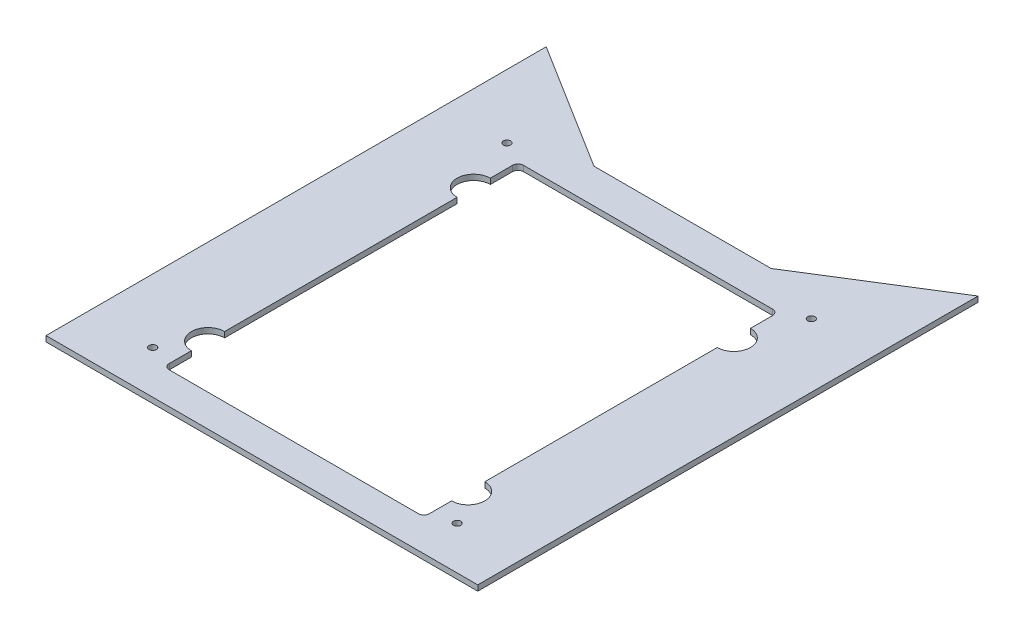
ISO-10303-21;
HEADER;
FILE_DESCRIPTION(('STEP AP214'),'2;1');
FILE_NAME('part.step','',(''),(''),'','','');
FILE_SCHEMA(('AUTOMOTIVE_DESIGN { 1 0 10303 214 1 1 1 1 }'));
ENDSEC;
DATA;
#1=APPLICATION_CONTEXT('core data for automotive mechanical design processes');
#2=APPLICATION_PROTOCOL_DEFINITION('international standard','automotive_design',2000,#1);
#3=PRODUCT_CONTEXT('',#1,'mechanical');
#4=PRODUCT('Part','Part','',(#3));
#5=PRODUCT_RELATED_PRODUCT_CATEGORY('part','',(#4));
#6=PRODUCT_DEFINITION_FORMATION('','',#4);
#7=PRODUCT_DEFINITION_CONTEXT('part definition',#1,'design');
#8=PRODUCT_DEFINITION('design','',#6,#7);
#9=PRODUCT_DEFINITION_SHAPE('','',#8);
#10=(LENGTH_UNIT() NAMED_UNIT(*) SI_UNIT(.MILLI.,.METRE.));
#11=(NAMED_UNIT(*) PLANE_ANGLE_UNIT() SI_UNIT($,.RADIAN.));
#12=(NAMED_UNIT(*) SI_UNIT($,.STERADIAN.) SOLID_ANGLE_UNIT());
#13=UNCERTAINTY_MEASURE_WITH_UNIT(LENGTH_MEASURE(1.E-05),#10,'distance_accuracy_value','');
#14=(GEOMETRIC_REPRESENTATION_CONTEXT(3) GLOBAL_UNCERTAINTY_ASSIGNED_CONTEXT((#13)) GLOBAL_UNIT_ASSIGNED_CONTEXT((#10,
#11,#12)) REPRESENTATION_CONTEXT('',''));
#15=CARTESIAN_POINT('',(0.,0.,0.));
#16=DIRECTION('',(0.,0.,1.));
#17=DIRECTION('',(1.,0.,0.));
#18=AXIS2_PLACEMENT_3D('',#15,#16,#17);
#19=CARTESIAN_POINT('',(0.,3.175,0.));
#20=DIRECTION('',(0.,1.,0.));
#21=DIRECTION('',(0.,0.,1.));
#22=AXIS2_PLACEMENT_3D('',#19,#20,#21);
#23=PLANE('',#22);
#24=DIRECTION('',(0.,0.,-1.));
#25=VECTOR('',#24,1.);
#26=CARTESIAN_POINT('',(-99.8118353735841,3.175,0.));
#27=LINE('',#26,#25);
#28=CARTESIAN_POINT('',(-99.8118353735841,3.175,438.1716513619));
#29=VERTEX_POINT('',#28);
#30=CARTESIAN_POINT('',(-99.8118353735841,3.175,151.2310263619));
#31=VERTEX_POINT('',#30);
#32=EDGE_CURVE('E57',#29,#31,#27,.T.);
#33=ORIENTED_EDGE('',*,*,#32,.F.);
#34=DIRECTION('',(1.,0.,0.));
#35=VECTOR('',#34,1.);
#36=CARTESIAN_POINT('',(-191.886835373584,3.175,438.1716513619));
#37=LINE('',#36,#35);
#38=CARTESIAN_POINT('',(147.838164626416,3.175,438.1716513619));
#39=VERTEX_POINT('',#38);
#40=EDGE_CURVE('E198',#29,#39,#37,.T.);
#41=ORIENTED_EDGE('',*,*,#40,.T.);
#42=DIRECTION('',(0.,0.,1.));
#43=VECTOR('',#42,1.);
#44=CARTESIAN_POINT('',(147.838164626416,3.175,0.));
#45=LINE('',#44,#43);
#46=CARTESIAN_POINT('',(147.838164626416,3.175,151.2310263619));
#47=VERTEX_POINT('',#46);
#48=EDGE_CURVE('E408',#47,#39,#45,.T.);
#49=ORIENTED_EDGE('',*,*,#48,.F.);
#50=DIRECTION('',(-0.847998304005083,0.,0.529998940003187));
#51=VECTOR('',#50,1.);
#52=CARTESIAN_POINT('',(176.413164626416,3.175,133.371651361899));
#53=LINE('',#52,#51);
#54=CARTESIAN_POINT('',(74.8131646264159,3.175,196.871651361901));
#55=VERTEX_POINT('',#54);
#56=EDGE_CURVE('E268',#47,#55,#53,.T.);
#57=ORIENTED_EDGE('',*,*,#56,.T.);
#58=DIRECTION('',(-1.,0.,0.));
#59=VECTOR('',#58,1.);
#60=CARTESIAN_POINT('',(74.8131646264159,3.175,196.871651361901));
#61=LINE('',#60,#59);
#62=CARTESIAN_POINT('',(-26.7868353735841,3.175,196.871651361901));
#63=VERTEX_POINT('',#62);
#64=EDGE_CURVE('E266',#55,#63,#61,.T.);
#65=ORIENTED_EDGE('',*,*,#64,.T.);
#66=DIRECTION('',(-0.847998304005083,0.,-0.529998940003187));
#67=VECTOR('',#66,1.);
#68=CARTESIAN_POINT('',(-128.386835373584,3.175,133.371651361899));
#69=LINE('',#68,#67);
#70=EDGE_CURVE('E211',#63,#31,#69,.T.);
#71=ORIENTED_EDGE('',*,*,#70,.T.);
#72=EDGE_LOOP('',(#33,#41,#49,#57,#65,#71));
#73=FACE_BOUND('',#72,.T.);
#74=CARTESIAN_POINT('',(111.32566462639,3.175,413.498576853187));
#75=DIRECTION('',(0.,1.,0.));
#76=DIRECTION('',(0.,0.,1.));
#77=AXIS2_PLACEMENT_3D('',#74,#75,#76);
#78=CIRCLE('',#77,2.08280000000002);
#79=CARTESIAN_POINT('',(111.32566462639,3.175,415.581376853187));
#80=VERTEX_POINT('',#79);
#81=EDGE_CURVE('E304',#80,#80,#78,.T.);
#82=ORIENTED_EDGE('',*,*,#81,.F.);
#83=EDGE_LOOP('',(#82));
#84=FACE_BOUND('',#83,.T.);
#85=CARTESIAN_POINT('',(-63.2993353736587,3.175,413.498576853187));
#86=DIRECTION('',(0.,1.,0.));
#87=DIRECTION('',(0.,0.,-1.));
#88=AXIS2_PLACEMENT_3D('',#85,#86,#87);
#89=CIRCLE('',#88,2.0828);
#90=CARTESIAN_POINT('',(-63.2993353736587,3.175,411.415776853187));
#91=VERTEX_POINT('',#90);
#92=EDGE_CURVE('E468',#91,#91,#89,.T.);
#93=ORIENTED_EDGE('',*,*,#92,.F.);
#94=EDGE_LOOP('',(#93));
#95=FACE_BOUND('',#94,.T.);
#96=CARTESIAN_POINT('',(-63.2993353736587,3.175,210.298576853187));
#97=DIRECTION('',(0.,1.,0.));
#98=DIRECTION('',(0.,0.,-1.));
#99=AXIS2_PLACEMENT_3D('',#96,#97,#98);
#100=CIRCLE('',#99,2.0828);
#101=CARTESIAN_POINT('',(-63.2993353736587,3.175,208.215776853187));
#102=VERTEX_POINT('',#101);
#103=EDGE_CURVE('E475',#102,#102,#100,.T.);
#104=ORIENTED_EDGE('',*,*,#103,.F.);
#105=EDGE_LOOP('',(#104));
#106=FACE_BOUND('',#105,.T.);
#107=CARTESIAN_POINT('',(98.6256646263904,3.175,394.448576853187));
#108=DIRECTION('',(0.,1.,0.));
#109=DIRECTION('',(0.,0.,1.));
#110=AXIS2_PLACEMENT_3D('',#107,#108,#109);
#111=CIRCLE('',#110,9.52500000000001);
#112=CARTESIAN_POINT('',(98.6256646263904,3.175,403.973576853187));
#113=VERTEX_POINT('',#112);
#114=CARTESIAN_POINT('',(98.6256646263904,3.175,384.923576853187));
#115=VERTEX_POINT('',#114);
#116=EDGE_CURVE('E364',#113,#115,#111,.T.);
#117=ORIENTED_EDGE('',*,*,#116,.F.);
#118=DIRECTION('',(0.,0.,-1.));
#119=VECTOR('',#118,1.);
#120=CARTESIAN_POINT('',(98.6256646263904,3.175,403.973576853187));
#121=LINE('',#120,#119);
#122=CARTESIAN_POINT('',(98.6256646263904,3.175,416.673576853187));
#123=VERTEX_POINT('',#122);
#124=EDGE_CURVE('E440',#123,#113,#121,.T.);
#125=ORIENTED_EDGE('',*,*,#124,.F.);
#126=CARTESIAN_POINT('',(95.4506646263903,3.175,416.673576853187));
#127=DIRECTION('',(0.,1.,0.));
#128=DIRECTION('',(0.,0.,1.));
#129=AXIS2_PLACEMENT_3D('',#126,#127,#128);
#130=CIRCLE('',#129,3.175);
#131=CARTESIAN_POINT('',(95.4506646263903,3.175,419.848576853187));
#132=VERTEX_POINT('',#131);
#133=EDGE_CURVE('E250',#123,#132,#130,.F.);
#134=ORIENTED_EDGE('',*,*,#133,.T.);
#135=DIRECTION('',(1.,0.,0.));
#136=VECTOR('',#135,1.);
#137=CARTESIAN_POINT('',(-50.5993353736097,3.175,419.848576853187));
#138=LINE('',#137,#136);
#139=CARTESIAN_POINT('',(-47.4243353736097,3.175,419.848576853187));
#140=VERTEX_POINT('',#139);
#141=EDGE_CURVE('E400',#140,#132,#138,.T.);
#142=ORIENTED_EDGE('',*,*,#141,.F.);
#143=CARTESIAN_POINT('',(-47.4243353736097,3.175,416.673576853187));
#144=DIRECTION('',(0.,1.,0.));
#145=DIRECTION('',(0.,0.,1.));
#146=AXIS2_PLACEMENT_3D('',#143,#144,#145);
#147=CIRCLE('',#146,3.175);
#148=CARTESIAN_POINT('',(-50.5993353736097,3.175,416.673576853187));
#149=VERTEX_POINT('',#148);
#150=EDGE_CURVE('E246',#140,#149,#147,.F.);
#151=ORIENTED_EDGE('',*,*,#150,.T.);
#152=DIRECTION('',(0.,0.,1.));
#153=VECTOR('',#152,1.);
#154=CARTESIAN_POINT('',(-50.5993353736097,3.175,403.973576853187));
#155=LINE('',#154,#153);
#156=CARTESIAN_POINT('',(-50.5993353736097,3.175,403.973576853187));
#157=VERTEX_POINT('',#156);
#158=EDGE_CURVE('E397',#157,#149,#155,.T.);
#159=ORIENTED_EDGE('',*,*,#158,.F.);
#160=CARTESIAN_POINT('',(-50.5993353736097,3.175,394.448576853187));
#161=DIRECTION('',(0.,1.,0.));
#162=DIRECTION('',(0.,0.,1.));
#163=AXIS2_PLACEMENT_3D('',#160,#161,#162);
#164=CIRCLE('',#163,9.52500000000001);
#165=CARTESIAN_POINT('',(-50.5993353736097,3.175,384.923576853187));
#166=VERTEX_POINT('',#165);
#167=EDGE_CURVE('E389',#166,#157,#164,.T.);
#168=ORIENTED_EDGE('',*,*,#167,.F.);
#169=DIRECTION('',(0.,0.,1.));
#170=VECTOR('',#169,1.);
#171=CARTESIAN_POINT('',(-50.5993353736097,3.175,251.573576853187));
#172=LINE('',#171,#170);
#173=CARTESIAN_POINT('',(-50.5993353736097,3.175,251.573576853187));
#174=VERTEX_POINT('',#173);
#175=EDGE_CURVE('E386',#174,#166,#172,.T.);
#176=ORIENTED_EDGE('',*,*,#175,.F.);
#177=CARTESIAN_POINT('',(-50.5993353736097,3.175,242.048576853187));
#178=DIRECTION('',(0.,1.,0.));
#179=DIRECTION('',(0.,0.,1.));
#180=AXIS2_PLACEMENT_3D('',#177,#178,#179);
#181=CIRCLE('',#180,9.52500000000001);
#182=CARTESIAN_POINT('',(-50.5993353736097,3.175,232.523576853187));
#183=VERTEX_POINT('',#182);
#184=EDGE_CURVE('E383',#183,#174,#181,.T.);
#185=ORIENTED_EDGE('',*,*,#184,.F.);
#186=DIRECTION('',(0.,0.,1.));
#187=VECTOR('',#186,1.);
#188=CARTESIAN_POINT('',(-50.5993353736097,3.175,216.648576853187));
#189=LINE('',#188,#187);
#190=CARTESIAN_POINT('',(-50.5993353736097,3.175,219.823576853187));
#191=VERTEX_POINT('',#190);
#192=EDGE_CURVE('E381',#191,#183,#189,.T.);
#193=ORIENTED_EDGE('',*,*,#192,.F.);
#194=CARTESIAN_POINT('',(-47.4243353736097,3.175,219.823576853187));
#195=DIRECTION('',(0.,1.,0.));
#196=DIRECTION('',(0.,0.,1.));
#197=AXIS2_PLACEMENT_3D('',#194,#195,#196);
#198=CIRCLE('',#197,3.175);
#199=CARTESIAN_POINT('',(-47.4243353736097,3.175,216.648576853187));
#200=VERTEX_POINT('',#199);
#201=EDGE_CURVE('E258',#191,#200,#198,.F.);
#202=ORIENTED_EDGE('',*,*,#201,.T.);
#203=DIRECTION('',(-1.,0.,0.));
#204=VECTOR('',#203,1.);
#205=CARTESIAN_POINT('',(-50.5993353736097,3.175,216.648576853187));
#206=LINE('',#205,#204);
#207=CARTESIAN_POINT('',(95.4506646263903,3.175,216.648576853187));
#208=VERTEX_POINT('',#207);
#209=EDGE_CURVE('E373',#208,#200,#206,.T.);
#210=ORIENTED_EDGE('',*,*,#209,.F.);
#211=CARTESIAN_POINT('',(95.4506646263903,3.175,219.823576853187));
#212=DIRECTION('',(0.,1.,0.));
#213=DIRECTION('',(0.,0.,1.));
#214=AXIS2_PLACEMENT_3D('',#211,#212,#213);
#215=CIRCLE('',#214,3.175);
#216=CARTESIAN_POINT('',(98.6256646263903,3.175,219.823576853187));
#217=VERTEX_POINT('',#216);
#218=EDGE_CURVE('E254',#208,#217,#215,.F.);
#219=ORIENTED_EDGE('',*,*,#218,.T.);
#220=DIRECTION('',(0.,0.,-1.));
#221=VECTOR('',#220,1.);
#222=CARTESIAN_POINT('',(98.6256646263903,3.175,216.648576853187));
#223=LINE('',#222,#221);
#224=CARTESIAN_POINT('',(98.6256646263903,3.175,232.523576853187));
#225=VERTEX_POINT('',#224);
#226=EDGE_CURVE('E369',#225,#217,#223,.T.);
#227=ORIENTED_EDGE('',*,*,#226,.F.);
#228=CARTESIAN_POINT('',(98.6256646263903,3.175,242.048576853187));
#229=DIRECTION('',(0.,1.,0.));
#230=DIRECTION('',(0.,0.,1.));
#231=AXIS2_PLACEMENT_3D('',#228,#229,#230);
#232=CIRCLE('',#231,9.52500000000001);
#233=CARTESIAN_POINT('',(98.6256646263903,3.175,251.573576853187));
#234=VERTEX_POINT('',#233);
#235=EDGE_CURVE('E363',#234,#225,#232,.T.);
#236=ORIENTED_EDGE('',*,*,#235,.F.);
#237=DIRECTION('',(0.,0.,-1.));
#238=VECTOR('',#237,1.);
#239=CARTESIAN_POINT('',(98.6256646263903,3.175,251.573576853187));
#240=LINE('',#239,#238);
#241=EDGE_CURVE('E360',#115,#234,#240,.T.);
#242=ORIENTED_EDGE('',*,*,#241,.F.);
#243=EDGE_LOOP('',(#117,#125,#134,#142,#151,#159,#168,#176,#185,#193,#202,#210,#219,#227,#236,#242));
#244=FACE_BOUND('',#243,.T.);
#245=CARTESIAN_POINT('',(111.32566462639,3.175,210.298576853187));
#246=DIRECTION('',(0.,1.,0.));
#247=DIRECTION('',(0.,0.,1.));
#248=AXIS2_PLACEMENT_3D('',#245,#246,#247);
#249=CIRCLE('',#248,2.0828);
#250=CARTESIAN_POINT('',(111.32566462639,3.175,212.381376853187));
#251=VERTEX_POINT('',#250);
#252=EDGE_CURVE('E203',#251,#251,#249,.T.);
#253=ORIENTED_EDGE('',*,*,#252,.F.);
#254=EDGE_LOOP('',(#253));
#255=FACE_BOUND('',#254,.T.);
#256=ADVANCED_FACE('F35',(#73,#84,#95,#106,#244,#255),#23,.T.);
#257=CARTESIAN_POINT('',(0.,0.,0.));
#258=DIRECTION('',(0.,1.,0.));
#259=DIRECTION('',(0.,0.,1.));
#260=AXIS2_PLACEMENT_3D('',#257,#258,#259);
#261=PLANE('',#260);
#262=CARTESIAN_POINT('',(111.32566462639,0.,413.498576853187));
#263=DIRECTION('',(0.,1.,0.));
#264=DIRECTION('',(0.,0.,1.));
#265=AXIS2_PLACEMENT_3D('',#262,#263,#264);
#266=CIRCLE('',#265,2.08280000000002);
#267=CARTESIAN_POINT('',(111.32566462639,0.,415.581376853187));
#268=VERTEX_POINT('',#267);
#269=EDGE_CURVE('E462',#268,#268,#266,.T.);
#270=ORIENTED_EDGE('',*,*,#269,.T.);
#271=EDGE_LOOP('',(#270));
#272=FACE_BOUND('',#271,.T.);
#273=CARTESIAN_POINT('',(-63.2993353736587,0.,413.498576853187));
#274=DIRECTION('',(0.,1.,0.));
#275=DIRECTION('',(0.,0.,-1.));
#276=AXIS2_PLACEMENT_3D('',#273,#274,#275);
#277=CIRCLE('',#276,2.0828);
#278=CARTESIAN_POINT('',(-63.2993353736587,0.,411.415776853187));
#279=VERTEX_POINT('',#278);
#280=EDGE_CURVE('E307',#279,#279,#277,.T.);
#281=ORIENTED_EDGE('',*,*,#280,.T.);
#282=EDGE_LOOP('',(#281));
#283=FACE_BOUND('',#282,.T.);
#284=CARTESIAN_POINT('',(-63.2993353736587,0.,210.298576853187));
#285=DIRECTION('',(0.,1.,0.));
#286=DIRECTION('',(0.,0.,-1.));
#287=AXIS2_PLACEMENT_3D('',#284,#285,#286);
#288=CIRCLE('',#287,2.0828);
#289=CARTESIAN_POINT('',(-63.2993353736587,0.,208.215776853187));
#290=VERTEX_POINT('',#289);
#291=EDGE_CURVE('E458',#290,#290,#288,.T.);
#292=ORIENTED_EDGE('',*,*,#291,.T.);
#293=EDGE_LOOP('',(#292));
#294=FACE_BOUND('',#293,.T.);
#295=DIRECTION('',(1.,0.,0.));
#296=VECTOR('',#295,1.);
#297=CARTESIAN_POINT('',(-50.5993353736097,0.,419.848576853187));
#298=LINE('',#297,#296);
#299=CARTESIAN_POINT('',(-47.4243353736097,0.,419.848576853187));
#300=VERTEX_POINT('',#299);
#301=CARTESIAN_POINT('',(95.4506646263903,0.,419.848576853187));
#302=VERTEX_POINT('',#301);
#303=EDGE_CURVE('E437',#300,#302,#298,.T.);
#304=ORIENTED_EDGE('',*,*,#303,.T.);
#305=CARTESIAN_POINT('',(95.4506646263903,0.,416.673576853187));
#306=DIRECTION('',(0.,1.,0.));
#307=DIRECTION('',(0.,0.,1.));
#308=AXIS2_PLACEMENT_3D('',#305,#306,#307);
#309=CIRCLE('',#308,3.175);
#310=CARTESIAN_POINT('',(98.6256646263904,0.,416.673576853187));
#311=VERTEX_POINT('',#310);
#312=EDGE_CURVE('E248',#302,#311,#309,.T.);
#313=ORIENTED_EDGE('',*,*,#312,.T.);
#314=DIRECTION('',(0.,0.,-1.));
#315=VECTOR('',#314,1.);
#316=CARTESIAN_POINT('',(98.6256646263904,0.,403.973576853187));
#317=LINE('',#316,#315);
#318=CARTESIAN_POINT('',(98.6256646263904,0.,403.973576853187));
#319=VERTEX_POINT('',#318);
#320=EDGE_CURVE('E405',#311,#319,#317,.T.);
#321=ORIENTED_EDGE('',*,*,#320,.T.);
#322=CARTESIAN_POINT('',(98.6256646263904,0.,394.448576853187));
#323=DIRECTION('',(0.,1.,0.));
#324=DIRECTION('',(0.,0.,1.));
#325=AXIS2_PLACEMENT_3D('',#322,#323,#324);
#326=CIRCLE('',#325,9.52500000000001);
#327=CARTESIAN_POINT('',(98.6256646263904,0.,384.923576853187));
#328=VERTEX_POINT('',#327);
#329=EDGE_CURVE('E407',#319,#328,#326,.T.);
#330=ORIENTED_EDGE('',*,*,#329,.T.);
#331=DIRECTION('',(0.,0.,-1.));
#332=VECTOR('',#331,1.);
#333=CARTESIAN_POINT('',(98.6256646263903,0.,251.573576853187));
#334=LINE('',#333,#332);
#335=CARTESIAN_POINT('',(98.6256646263903,0.,251.573576853187));
#336=VERTEX_POINT('',#335);
#337=EDGE_CURVE('E411',#328,#336,#334,.T.);
#338=ORIENTED_EDGE('',*,*,#337,.T.);
#339=CARTESIAN_POINT('',(98.6256646263903,0.,242.048576853187));
#340=DIRECTION('',(0.,1.,0.));
#341=DIRECTION('',(0.,0.,1.));
#342=AXIS2_PLACEMENT_3D('',#339,#340,#341);
#343=CIRCLE('',#342,9.52500000000001);
#344=CARTESIAN_POINT('',(98.6256646263903,0.,232.523576853187));
#345=VERTEX_POINT('',#344);
#346=EDGE_CURVE('E414',#336,#345,#343,.T.);
#347=ORIENTED_EDGE('',*,*,#346,.T.);
#348=DIRECTION('',(0.,0.,-1.));
#349=VECTOR('',#348,1.);
#350=CARTESIAN_POINT('',(98.6256646263903,0.,216.648576853187));
#351=LINE('',#350,#349);
#352=CARTESIAN_POINT('',(98.6256646263903,0.,219.823576853187));
#353=VERTEX_POINT('',#352);
#354=EDGE_CURVE('E417',#345,#353,#351,.T.);
#355=ORIENTED_EDGE('',*,*,#354,.T.);
#356=CARTESIAN_POINT('',(95.4506646263903,0.,219.823576853187));
#357=DIRECTION('',(0.,1.,0.));
#358=DIRECTION('',(0.,0.,1.));
#359=AXIS2_PLACEMENT_3D('',#356,#357,#358);
#360=CIRCLE('',#359,3.175);
#361=CARTESIAN_POINT('',(95.4506646263903,0.,216.648576853187));
#362=VERTEX_POINT('',#361);
#363=EDGE_CURVE('E252',#353,#362,#360,.T.);
#364=ORIENTED_EDGE('',*,*,#363,.T.);
#365=DIRECTION('',(-1.,0.,0.));
#366=VECTOR('',#365,1.);
#367=CARTESIAN_POINT('',(-50.5993353736097,0.,216.648576853187));
#368=LINE('',#367,#366);
#369=CARTESIAN_POINT('',(-47.4243353736097,0.,216.648576853187));
#370=VERTEX_POINT('',#369);
#371=EDGE_CURVE('E420',#362,#370,#368,.T.);
#372=ORIENTED_EDGE('',*,*,#371,.T.);
#373=CARTESIAN_POINT('',(-47.4243353736097,0.,219.823576853187));
#374=DIRECTION('',(0.,1.,0.));
#375=DIRECTION('',(0.,0.,1.));
#376=AXIS2_PLACEMENT_3D('',#373,#374,#375);
#377=CIRCLE('',#376,3.175);
#378=CARTESIAN_POINT('',(-50.5993353736097,0.,219.823576853187));
#379=VERTEX_POINT('',#378);
#380=EDGE_CURVE('E256',#370,#379,#377,.T.);
#381=ORIENTED_EDGE('',*,*,#380,.T.);
#382=DIRECTION('',(0.,0.,1.));
#383=VECTOR('',#382,1.);
#384=CARTESIAN_POINT('',(-50.5993353736097,0.,216.648576853187));
#385=LINE('',#384,#383);
#386=CARTESIAN_POINT('',(-50.5993353736097,0.,232.523576853187));
#387=VERTEX_POINT('',#386);
#388=EDGE_CURVE('E423',#379,#387,#385,.T.);
#389=ORIENTED_EDGE('',*,*,#388,.T.);
#390=CARTESIAN_POINT('',(-50.5993353736097,0.,242.048576853187));
#391=DIRECTION('',(0.,1.,0.));
#392=DIRECTION('',(0.,0.,1.));
#393=AXIS2_PLACEMENT_3D('',#390,#391,#392);
#394=CIRCLE('',#393,9.52500000000001);
#395=CARTESIAN_POINT('',(-50.5993353736097,0.,251.573576853187));
#396=VERTEX_POINT('',#395);
#397=EDGE_CURVE('E425',#387,#396,#394,.T.);
#398=ORIENTED_EDGE('',*,*,#397,.T.);
#399=DIRECTION('',(0.,0.,1.));
#400=VECTOR('',#399,1.);
#401=CARTESIAN_POINT('',(-50.5993353736097,0.,251.573576853187));
#402=LINE('',#401,#400);
#403=CARTESIAN_POINT('',(-50.5993353736097,0.,384.923576853187));
#404=VERTEX_POINT('',#403);
#405=EDGE_CURVE('E428',#396,#404,#402,.T.);
#406=ORIENTED_EDGE('',*,*,#405,.T.);
#407=CARTESIAN_POINT('',(-50.5993353736097,0.,394.448576853187));
#408=DIRECTION('',(0.,1.,0.));
#409=DIRECTION('',(0.,0.,1.));
#410=AXIS2_PLACEMENT_3D('',#407,#408,#409);
#411=CIRCLE('',#410,9.52500000000001);
#412=CARTESIAN_POINT('',(-50.5993353736097,0.,403.973576853187));
#413=VERTEX_POINT('',#412);
#414=EDGE_CURVE('E431',#404,#413,#411,.T.);
#415=ORIENTED_EDGE('',*,*,#414,.T.);
#416=DIRECTION('',(0.,0.,1.));
#417=VECTOR('',#416,1.);
#418=CARTESIAN_POINT('',(-50.5993353736097,0.,403.973576853187));
#419=LINE('',#418,#417);
#420=CARTESIAN_POINT('',(-50.5993353736097,0.,416.673576853187));
#421=VERTEX_POINT('',#420);
#422=EDGE_CURVE('E434',#413,#421,#419,.T.);
#423=ORIENTED_EDGE('',*,*,#422,.T.);
#424=CARTESIAN_POINT('',(-47.4243353736097,0.,416.673576853187));
#425=DIRECTION('',(0.,1.,0.));
#426=DIRECTION('',(0.,0.,1.));
#427=AXIS2_PLACEMENT_3D('',#424,#425,#426);
#428=CIRCLE('',#427,3.175);
#429=EDGE_CURVE('E244',#421,#300,#428,.T.);
#430=ORIENTED_EDGE('',*,*,#429,.T.);
#431=EDGE_LOOP('',(#304,#313,#321,#330,#338,#347,#355,#364,#372,#381,#389,#398,#406,#415,#423,#430));
#432=FACE_BOUND('',#431,.T.);
#433=CARTESIAN_POINT('',(111.32566462639,0.,210.298576853187));
#434=DIRECTION('',(0.,1.,0.));
#435=DIRECTION('',(0.,0.,1.));
#436=AXIS2_PLACEMENT_3D('',#433,#434,#435);
#437=CIRCLE('',#436,2.0828);
#438=CARTESIAN_POINT('',(111.32566462639,0.,212.381376853187));
#439=VERTEX_POINT('',#438);
#440=EDGE_CURVE('E208',#439,#439,#437,.T.);
#441=ORIENTED_EDGE('',*,*,#440,.T.);
#442=EDGE_LOOP('',(#441));
#443=FACE_BOUND('',#442,.T.);
#444=DIRECTION('',(1.,0.,0.));
#445=VECTOR('',#444,1.);
#446=CARTESIAN_POINT('',(-191.886835373584,0.,438.1716513619));
#447=LINE('',#446,#445);
#448=CARTESIAN_POINT('',(-99.8118353735841,0.,438.1716513619));
#449=VERTEX_POINT('',#448);
#450=CARTESIAN_POINT('',(147.838164626416,0.,438.1716513619));
#451=VERTEX_POINT('',#450);
#452=EDGE_CURVE('E196',#449,#451,#447,.T.);
#453=ORIENTED_EDGE('',*,*,#452,.F.);
#454=DIRECTION('',(0.,0.,-1.));
#455=VECTOR('',#454,1.);
#456=CARTESIAN_POINT('',(-99.8118353735841,0.,82.5716513619005));
#457=LINE('',#456,#455);
#458=CARTESIAN_POINT('',(-99.8118353735841,0.,151.2310263619));
#459=VERTEX_POINT('',#458);
#460=EDGE_CURVE('E181',#449,#459,#457,.T.);
#461=ORIENTED_EDGE('',*,*,#460,.T.);
#462=DIRECTION('',(-0.847998304005083,0.,-0.529998940003187));
#463=VECTOR('',#462,1.);
#464=CARTESIAN_POINT('',(-128.386835373584,0.,133.371651361899));
#465=LINE('',#464,#463);
#466=CARTESIAN_POINT('',(-26.7868353735841,0.,196.871651361901));
#467=VERTEX_POINT('',#466);
#468=EDGE_CURVE('E216',#467,#459,#465,.T.);
#469=ORIENTED_EDGE('',*,*,#468,.F.);
#470=DIRECTION('',(-1.,0.,0.));
#471=VECTOR('',#470,1.);
#472=CARTESIAN_POINT('',(74.8131646264159,0.,196.871651361901));
#473=LINE('',#472,#471);
#474=CARTESIAN_POINT('',(74.8131646264159,0.,196.871651361901));
#475=VERTEX_POINT('',#474);
#476=EDGE_CURVE('E205',#475,#467,#473,.T.);
#477=ORIENTED_EDGE('',*,*,#476,.F.);
#478=DIRECTION('',(-0.847998304005083,0.,0.529998940003187));
#479=VECTOR('',#478,1.);
#480=CARTESIAN_POINT('',(176.413164626416,0.,133.371651361899));
#481=LINE('',#480,#479);
#482=CARTESIAN_POINT('',(147.838164626416,0.,151.2310263619));
#483=VERTEX_POINT('',#482);
#484=EDGE_CURVE('E202',#483,#475,#481,.T.);
#485=ORIENTED_EDGE('',*,*,#484,.F.);
#486=DIRECTION('',(0.,0.,1.));
#487=VECTOR('',#486,1.);
#488=CARTESIAN_POINT('',(147.838164626416,0.,82.5716513619005));
#489=LINE('',#488,#487);
#490=EDGE_CURVE('E50',#483,#451,#489,.T.);
#491=ORIENTED_EDGE('',*,*,#490,.T.);
#492=EDGE_LOOP('',(#453,#461,#469,#477,#485,#491));
#493=FACE_BOUND('',#492,.T.);
#494=ADVANCED_FACE('F200',(#272,#283,#294,#432,#443,#493),#261,.F.);
#495=CARTESIAN_POINT('',(-191.886835373584,3.175,438.1716513619));
#496=DIRECTION('',(0.,0.,-1.));
#497=DIRECTION('',(-1.,0.,0.));
#498=AXIS2_PLACEMENT_3D('',#495,#496,#497);
#499=PLANE('',#498);
#500=ORIENTED_EDGE('',*,*,#40,.F.);
#501=DIRECTION('',(0.,1.,0.));
#502=VECTOR('',#501,1.);
#503=CARTESIAN_POINT('',(-99.8118353735841,0.,438.1716513619));
#504=LINE('',#503,#502);
#505=EDGE_CURVE('E184',#449,#29,#504,.T.);
#506=ORIENTED_EDGE('',*,*,#505,.F.);
#507=ORIENTED_EDGE('',*,*,#452,.T.);
#508=DIRECTION('',(0.,1.,0.));
#509=VECTOR('',#508,1.);
#510=CARTESIAN_POINT('',(147.838164626416,0.,438.1716513619));
#511=LINE('',#510,#509);
#512=EDGE_CURVE('E189',#451,#39,#511,.T.);
#513=ORIENTED_EDGE('',*,*,#512,.T.);
#514=EDGE_LOOP('',(#500,#506,#507,#513));
#515=FACE_BOUND('',#514,.T.);
#516=ADVANCED_FACE('F194',(#515),#499,.F.);
#517=CARTESIAN_POINT('',(176.413164626416,3.175,133.371651361899));
#518=DIRECTION('',(0.529998940003187,0.,0.847998304005083));
#519=DIRECTION('',(0.847998304005084,0.,-0.529998940003187));
#520=AXIS2_PLACEMENT_3D('',#517,#518,#519);
#521=PLANE('',#520);
#522=ORIENTED_EDGE('',*,*,#56,.F.);
#523=DIRECTION('',(0.,-1.,0.));
#524=VECTOR('',#523,1.);
#525=CARTESIAN_POINT('',(147.838164626416,3.175,151.2310263619));
#526=LINE('',#525,#524);
#527=EDGE_CURVE('E12',#47,#483,#526,.T.);
#528=ORIENTED_EDGE('',*,*,#527,.T.);
#529=ORIENTED_EDGE('',*,*,#484,.T.);
#530=DIRECTION('',(0.,-1.,0.));
#531=VECTOR('',#530,1.);
#532=CARTESIAN_POINT('',(74.8131646264159,3.175,196.871651361901));
#533=LINE('',#532,#531);
#534=EDGE_CURVE('E221',#55,#475,#533,.T.);
#535=ORIENTED_EDGE('',*,*,#534,.F.);
#536=EDGE_LOOP('',(#522,#528,#529,#535));
#537=FACE_BOUND('',#536,.T.);
#538=ADVANCED_FACE('F589',(#537),#521,.F.);
#539=CARTESIAN_POINT('',(74.8131646264159,3.175,196.871651361901));
#540=DIRECTION('',(0.,0.,1.));
#541=DIRECTION('',(1.,0.,0.));
#542=AXIS2_PLACEMENT_3D('',#539,#540,#541);
#543=PLANE('',#542);
#544=ORIENTED_EDGE('',*,*,#476,.T.);
#545=DIRECTION('',(0.,-1.,0.));
#546=VECTOR('',#545,1.);
#547=CARTESIAN_POINT('',(-26.7868353735841,3.175,196.871651361901));
#548=LINE('',#547,#546);
#549=EDGE_CURVE('E218',#63,#467,#548,.T.);
#550=ORIENTED_EDGE('',*,*,#549,.F.);
#551=ORIENTED_EDGE('',*,*,#64,.F.);
#552=ORIENTED_EDGE('',*,*,#534,.T.);
#553=EDGE_LOOP('',(#544,#550,#551,#552));
#554=FACE_BOUND('',#553,.T.);
#555=ADVANCED_FACE('F586',(#554),#543,.F.);
#556=CARTESIAN_POINT('',(-128.386835373584,3.175,133.371651361899));
#557=DIRECTION('',(-0.529998940003187,0.,0.847998304005083));
#558=DIRECTION('',(0.847998304005083,0.,0.529998940003187));
#559=AXIS2_PLACEMENT_3D('',#556,#557,#558);
#560=PLANE('',#559);
#561=ORIENTED_EDGE('',*,*,#468,.T.);
#562=DIRECTION('',(0.,1.,0.));
#563=VECTOR('',#562,1.);
#564=CARTESIAN_POINT('',(-99.8118353735841,3.175,151.2310263619));
#565=LINE('',#564,#563);
#566=EDGE_CURVE('E43',#459,#31,#565,.T.);
#567=ORIENTED_EDGE('',*,*,#566,.T.);
#568=ORIENTED_EDGE('',*,*,#70,.F.);
#569=ORIENTED_EDGE('',*,*,#549,.T.);
#570=EDGE_LOOP('',(#561,#567,#568,#569));
#571=FACE_BOUND('',#570,.T.);
#572=ADVANCED_FACE('F262',(#571),#560,.F.);
#573=CARTESIAN_POINT('',(111.32566462639,3.175,210.298576853187));
#574=DIRECTION('',(0.,-1.,0.));
#575=DIRECTION('',(0.,0.,-1.));
#576=AXIS2_PLACEMENT_3D('',#573,#574,#575);
#577=CYLINDRICAL_SURFACE('',#576,2.0828);
#578=ORIENTED_EDGE('',*,*,#252,.T.);
#579=EDGE_LOOP('',(#578));
#580=FACE_BOUND('',#579,.T.);
#581=ORIENTED_EDGE('',*,*,#440,.F.);
#582=EDGE_LOOP('',(#581));
#583=FACE_BOUND('',#582,.T.);
#584=ADVANCED_FACE('F581',(#580,#583),#577,.F.);
#585=CARTESIAN_POINT('',(98.6256646263904,3.175,403.973576853187));
#586=DIRECTION('',(-1.,0.,0.));
#587=DIRECTION('',(0.,0.,1.));
#588=AXIS2_PLACEMENT_3D('',#585,#586,#587);
#589=PLANE('',#588);
#590=ORIENTED_EDGE('',*,*,#320,.F.);
#591=DIRECTION('',(0.,-1.,0.));
#592=VECTOR('',#591,1.);
#593=CARTESIAN_POINT('',(98.6256646263904,3.175,416.673576853187));
#594=LINE('',#593,#592);
#595=EDGE_CURVE('E232',#311,#123,#594,.F.);
#596=ORIENTED_EDGE('',*,*,#595,.T.);
#597=ORIENTED_EDGE('',*,*,#124,.T.);
#598=DIRECTION('',(0.,-1.,0.));
#599=VECTOR('',#598,1.);
#600=CARTESIAN_POINT('',(98.6256646263904,3.175,403.973576853187));
#601=LINE('',#600,#599);
#602=EDGE_CURVE('E455',#113,#319,#601,.T.);
#603=ORIENTED_EDGE('',*,*,#602,.T.);
#604=EDGE_LOOP('',(#590,#596,#597,#603));
#605=FACE_BOUND('',#604,.T.);
#606=ADVANCED_FACE('F515',(#605),#589,.T.);
#607=CARTESIAN_POINT('',(98.6256646263904,3.175,394.448576853187));
#608=DIRECTION('',(0.,-1.,0.));
#609=DIRECTION('',(0.,0.,-1.));
#610=AXIS2_PLACEMENT_3D('',#607,#608,#609);
#611=CYLINDRICAL_SURFACE('',#610,9.52500000000001);
#612=ORIENTED_EDGE('',*,*,#329,.F.);
#613=ORIENTED_EDGE('',*,*,#602,.F.);
#614=ORIENTED_EDGE('',*,*,#116,.T.);
#615=DIRECTION('',(0.,-1.,0.));
#616=VECTOR('',#615,1.);
#617=CARTESIAN_POINT('',(98.6256646263904,3.175,384.923576853187));
#618=LINE('',#617,#616);
#619=EDGE_CURVE('E453',#115,#328,#618,.T.);
#620=ORIENTED_EDGE('',*,*,#619,.T.);
#621=EDGE_LOOP('',(#612,#613,#614,#620));
#622=FACE_BOUND('',#621,.T.);
#623=ADVANCED_FACE('F494',(#622),#611,.F.);
#624=CARTESIAN_POINT('',(98.6256646263903,3.175,251.573576853187));
#625=DIRECTION('',(-1.,0.,0.));
#626=DIRECTION('',(0.,0.,1.));
#627=AXIS2_PLACEMENT_3D('',#624,#625,#626);
#628=PLANE('',#627);
#629=ORIENTED_EDGE('',*,*,#337,.F.);
#630=ORIENTED_EDGE('',*,*,#619,.F.);
#631=ORIENTED_EDGE('',*,*,#241,.T.);
#632=DIRECTION('',(0.,-1.,0.));
#633=VECTOR('',#632,1.);
#634=CARTESIAN_POINT('',(98.6256646263903,3.175,251.573576853187));
#635=LINE('',#634,#633);
#636=EDGE_CURVE('E451',#234,#336,#635,.T.);
#637=ORIENTED_EDGE('',*,*,#636,.T.);
#638=EDGE_LOOP('',(#629,#630,#631,#637));
#639=FACE_BOUND('',#638,.T.);
#640=ADVANCED_FACE('F499',(#639),#628,.T.);
#641=CARTESIAN_POINT('',(98.6256646263903,3.175,242.048576853187));
#642=DIRECTION('',(0.,-1.,0.));
#643=DIRECTION('',(0.,0.,-1.));
#644=AXIS2_PLACEMENT_3D('',#641,#642,#643);
#645=CYLINDRICAL_SURFACE('',#644,9.52500000000001);
#646=ORIENTED_EDGE('',*,*,#346,.F.);
#647=ORIENTED_EDGE('',*,*,#636,.F.);
#648=ORIENTED_EDGE('',*,*,#235,.T.);
#649=DIRECTION('',(0.,-1.,0.));
#650=VECTOR('',#649,1.);
#651=CARTESIAN_POINT('',(98.6256646263903,3.175,232.523576853187));
#652=LINE('',#651,#650);
#653=EDGE_CURVE('E449',#225,#345,#652,.T.);
#654=ORIENTED_EDGE('',*,*,#653,.T.);
#655=EDGE_LOOP('',(#646,#647,#648,#654));
#656=FACE_BOUND('',#655,.T.);
#657=ADVANCED_FACE('F507',(#656),#645,.F.);
#658=CARTESIAN_POINT('',(98.6256646263903,3.175,216.648576853187));
#659=DIRECTION('',(-1.,0.,0.));
#660=DIRECTION('',(0.,0.,1.));
#661=AXIS2_PLACEMENT_3D('',#658,#659,#660);
#662=PLANE('',#661);
#663=ORIENTED_EDGE('',*,*,#226,.T.);
#664=DIRECTION('',(0.,-1.,0.));
#665=VECTOR('',#664,1.);
#666=CARTESIAN_POINT('',(98.6256646263903,0.,219.823576853187));
#667=LINE('',#666,#665);
#668=EDGE_CURVE('E234',#217,#353,#667,.T.);
#669=ORIENTED_EDGE('',*,*,#668,.T.);
#670=ORIENTED_EDGE('',*,*,#354,.F.);
#671=ORIENTED_EDGE('',*,*,#653,.F.);
#672=EDGE_LOOP('',(#663,#669,#670,#671));
#673=FACE_BOUND('',#672,.T.);
#674=ADVANCED_FACE('F510',(#673),#662,.T.);
#675=CARTESIAN_POINT('',(-50.5993353736097,3.175,216.648576853187));
#676=DIRECTION('',(0.,0.,1.));
#677=DIRECTION('',(1.,0.,0.));
#678=AXIS2_PLACEMENT_3D('',#675,#676,#677);
#679=PLANE('',#678);
#680=ORIENTED_EDGE('',*,*,#371,.F.);
#681=DIRECTION('',(0.,-1.,0.));
#682=VECTOR('',#681,1.);
#683=CARTESIAN_POINT('',(95.4506646263903,3.175,216.648576853187));
#684=LINE('',#683,#682);
#685=EDGE_CURVE('E240',#362,#208,#684,.F.);
#686=ORIENTED_EDGE('',*,*,#685,.T.);
#687=ORIENTED_EDGE('',*,*,#209,.T.);
#688=DIRECTION('',(0.,-1.,0.));
#689=VECTOR('',#688,1.);
#690=CARTESIAN_POINT('',(-47.4243353736097,0.,216.648576853187));
#691=LINE('',#690,#689);
#692=EDGE_CURVE('E237',#200,#370,#691,.T.);
#693=ORIENTED_EDGE('',*,*,#692,.T.);
#694=EDGE_LOOP('',(#680,#686,#687,#693));
#695=FACE_BOUND('',#694,.T.);
#696=ADVANCED_FACE('F562',(#695),#679,.T.);
#697=CARTESIAN_POINT('',(-50.5993353736097,3.175,216.648576853187));
#698=DIRECTION('',(1.,0.,0.));
#699=DIRECTION('',(0.,0.,-1.));
#700=AXIS2_PLACEMENT_3D('',#697,#698,#699);
#701=PLANE('',#700);
#702=ORIENTED_EDGE('',*,*,#388,.F.);
#703=DIRECTION('',(0.,-1.,0.));
#704=VECTOR('',#703,1.);
#705=CARTESIAN_POINT('',(-50.5993353736097,3.175,219.823576853187));
#706=LINE('',#705,#704);
#707=EDGE_CURVE('E242',#379,#191,#706,.F.);
#708=ORIENTED_EDGE('',*,*,#707,.T.);
#709=ORIENTED_EDGE('',*,*,#192,.T.);
#710=DIRECTION('',(0.,-1.,0.));
#711=VECTOR('',#710,1.);
#712=CARTESIAN_POINT('',(-50.5993353736097,3.175,232.523576853187));
#713=LINE('',#712,#711);
#714=EDGE_CURVE('E446',#183,#387,#713,.T.);
#715=ORIENTED_EDGE('',*,*,#714,.T.);
#716=EDGE_LOOP('',(#702,#708,#709,#715));
#717=FACE_BOUND('',#716,.T.);
#718=ADVANCED_FACE('F553',(#717),#701,.T.);
#719=CARTESIAN_POINT('',(-50.5993353736097,3.175,242.048576853187));
#720=DIRECTION('',(0.,-1.,0.));
#721=DIRECTION('',(0.,0.,-1.));
#722=AXIS2_PLACEMENT_3D('',#719,#720,#721);
#723=CYLINDRICAL_SURFACE('',#722,9.52500000000001);
#724=ORIENTED_EDGE('',*,*,#397,.F.);
#725=ORIENTED_EDGE('',*,*,#714,.F.);
#726=ORIENTED_EDGE('',*,*,#184,.T.);
#727=DIRECTION('',(0.,-1.,0.));
#728=VECTOR('',#727,1.);
#729=CARTESIAN_POINT('',(-50.5993353736097,3.175,251.573576853187));
#730=LINE('',#729,#728);
#731=EDGE_CURVE('E444',#174,#396,#730,.T.);
#732=ORIENTED_EDGE('',*,*,#731,.T.);
#733=EDGE_LOOP('',(#724,#725,#726,#732));
#734=FACE_BOUND('',#733,.T.);
#735=ADVANCED_FACE('F549',(#734),#723,.F.);
#736=CARTESIAN_POINT('',(-50.5993353736097,3.175,251.573576853187));
#737=DIRECTION('',(1.,0.,0.));
#738=DIRECTION('',(0.,0.,-1.));
#739=AXIS2_PLACEMENT_3D('',#736,#737,#738);
#740=PLANE('',#739);
#741=ORIENTED_EDGE('',*,*,#405,.F.);
#742=ORIENTED_EDGE('',*,*,#731,.F.);
#743=ORIENTED_EDGE('',*,*,#175,.T.);
#744=DIRECTION('',(0.,-1.,0.));
#745=VECTOR('',#744,1.);
#746=CARTESIAN_POINT('',(-50.5993353736097,3.175,384.923576853187));
#747=LINE('',#746,#745);
#748=EDGE_CURVE('E442',#166,#404,#747,.T.);
#749=ORIENTED_EDGE('',*,*,#748,.T.);
#750=EDGE_LOOP('',(#741,#742,#743,#749));
#751=FACE_BOUND('',#750,.T.);
#752=ADVANCED_FACE('F546',(#751),#740,.T.);
#753=CARTESIAN_POINT('',(-50.5993353736097,3.175,394.448576853187));
#754=DIRECTION('',(0.,-1.,0.));
#755=DIRECTION('',(0.,0.,-1.));
#756=AXIS2_PLACEMENT_3D('',#753,#754,#755);
#757=CYLINDRICAL_SURFACE('',#756,9.52500000000001);
#758=ORIENTED_EDGE('',*,*,#414,.F.);
#759=ORIENTED_EDGE('',*,*,#748,.F.);
#760=ORIENTED_EDGE('',*,*,#167,.T.);
#761=DIRECTION('',(0.,-1.,0.));
#762=VECTOR('',#761,1.);
#763=CARTESIAN_POINT('',(-50.5993353736097,3.175,403.973576853187));
#764=LINE('',#763,#762);
#765=EDGE_CURVE('E404',#157,#413,#764,.T.);
#766=ORIENTED_EDGE('',*,*,#765,.T.);
#767=EDGE_LOOP('',(#758,#759,#760,#766));
#768=FACE_BOUND('',#767,.T.);
#769=ADVANCED_FACE('F538',(#768),#757,.F.);
#770=CARTESIAN_POINT('',(-50.5993353736097,3.175,403.973576853187));
#771=DIRECTION('',(1.,0.,0.));
#772=DIRECTION('',(0.,0.,-1.));
#773=AXIS2_PLACEMENT_3D('',#770,#771,#772);
#774=PLANE('',#773);
#775=ORIENTED_EDGE('',*,*,#158,.T.);
#776=DIRECTION('',(0.,-1.,0.));
#777=VECTOR('',#776,1.);
#778=CARTESIAN_POINT('',(-50.5993353736097,0.,416.673576853187));
#779=LINE('',#778,#777);
#780=EDGE_CURVE('E224',#149,#421,#779,.T.);
#781=ORIENTED_EDGE('',*,*,#780,.T.);
#782=ORIENTED_EDGE('',*,*,#422,.F.);
#783=ORIENTED_EDGE('',*,*,#765,.F.);
#784=EDGE_LOOP('',(#775,#781,#782,#783));
#785=FACE_BOUND('',#784,.T.);
#786=ADVANCED_FACE('F534',(#785),#774,.T.);
#787=CARTESIAN_POINT('',(-50.5993353736097,3.175,419.848576853187));
#788=DIRECTION('',(0.,0.,-1.));
#789=DIRECTION('',(-1.,0.,0.));
#790=AXIS2_PLACEMENT_3D('',#787,#788,#789);
#791=PLANE('',#790);
#792=ORIENTED_EDGE('',*,*,#303,.F.);
#793=DIRECTION('',(0.,-1.,0.));
#794=VECTOR('',#793,1.);
#795=CARTESIAN_POINT('',(-47.4243353736097,3.175,419.848576853187));
#796=LINE('',#795,#794);
#797=EDGE_CURVE('E230',#300,#140,#796,.F.);
#798=ORIENTED_EDGE('',*,*,#797,.T.);
#799=ORIENTED_EDGE('',*,*,#141,.T.);
#800=DIRECTION('',(0.,-1.,0.));
#801=VECTOR('',#800,1.);
#802=CARTESIAN_POINT('',(95.4506646263903,0.,419.848576853187));
#803=LINE('',#802,#801);
#804=EDGE_CURVE('E227',#132,#302,#803,.T.);
#805=ORIENTED_EDGE('',*,*,#804,.T.);
#806=EDGE_LOOP('',(#792,#798,#799,#805));
#807=FACE_BOUND('',#806,.T.);
#808=ADVANCED_FACE('F525',(#807),#791,.T.);
#809=CARTESIAN_POINT('',(-63.2993353736587,3.175,210.298576853187));
#810=DIRECTION('',(0.,-1.,0.));
#811=DIRECTION('',(0.,0.,-1.));
#812=AXIS2_PLACEMENT_3D('',#809,#810,#811);
#813=CYLINDRICAL_SURFACE('',#812,2.0828);
#814=ORIENTED_EDGE('',*,*,#103,.T.);
#815=EDGE_LOOP('',(#814));
#816=FACE_BOUND('',#815,.T.);
#817=ORIENTED_EDGE('',*,*,#291,.F.);
#818=EDGE_LOOP('',(#817));
#819=FACE_BOUND('',#818,.T.);
#820=ADVANCED_FACE('F607',(#816,#819),#813,.F.);
#821=CARTESIAN_POINT('',(-63.2993353736587,3.175,413.498576853187));
#822=DIRECTION('',(0.,-1.,0.));
#823=DIRECTION('',(0.,0.,-1.));
#824=AXIS2_PLACEMENT_3D('',#821,#822,#823);
#825=CYLINDRICAL_SURFACE('',#824,2.0828);
#826=ORIENTED_EDGE('',*,*,#92,.T.);
#827=EDGE_LOOP('',(#826));
#828=FACE_BOUND('',#827,.T.);
#829=ORIENTED_EDGE('',*,*,#280,.F.);
#830=EDGE_LOOP('',(#829));
#831=FACE_BOUND('',#830,.T.);
#832=ADVANCED_FACE('F601',(#828,#831),#825,.F.);
#833=CARTESIAN_POINT('',(111.32566462639,3.175,413.498576853187));
#834=DIRECTION('',(0.,-1.,0.));
#835=DIRECTION('',(0.,0.,-1.));
#836=AXIS2_PLACEMENT_3D('',#833,#834,#835);
#837=CYLINDRICAL_SURFACE('',#836,2.08280000000002);
#838=ORIENTED_EDGE('',*,*,#81,.T.);
#839=EDGE_LOOP('',(#838));
#840=FACE_BOUND('',#839,.T.);
#841=ORIENTED_EDGE('',*,*,#269,.F.);
#842=EDGE_LOOP('',(#841));
#843=FACE_BOUND('',#842,.T.);
#844=ADVANCED_FACE('F597',(#840,#843),#837,.F.);
#845=CARTESIAN_POINT('',(-47.4243353736097,3.175,416.673576853187));
#846=DIRECTION('',(0.,1.,0.));
#847=DIRECTION('',(0.,0.,1.));
#848=AXIS2_PLACEMENT_3D('',#845,#846,#847);
#849=CYLINDRICAL_SURFACE('',#848,3.175);
#850=ORIENTED_EDGE('',*,*,#150,.F.);
#851=ORIENTED_EDGE('',*,*,#797,.F.);
#852=ORIENTED_EDGE('',*,*,#429,.F.);
#853=ORIENTED_EDGE('',*,*,#780,.F.);
#854=EDGE_LOOP('',(#850,#851,#852,#853));
#855=FACE_BOUND('',#854,.T.);
#856=ADVANCED_FACE('F528',(#855),#849,.F.);
#857=CARTESIAN_POINT('',(95.4506646263903,3.175,416.673576853187));
#858=DIRECTION('',(0.,1.,0.));
#859=DIRECTION('',(0.,0.,1.));
#860=AXIS2_PLACEMENT_3D('',#857,#858,#859);
#861=CYLINDRICAL_SURFACE('',#860,3.175);
#862=ORIENTED_EDGE('',*,*,#133,.F.);
#863=ORIENTED_EDGE('',*,*,#595,.F.);
#864=ORIENTED_EDGE('',*,*,#312,.F.);
#865=ORIENTED_EDGE('',*,*,#804,.F.);
#866=EDGE_LOOP('',(#862,#863,#864,#865));
#867=FACE_BOUND('',#866,.T.);
#868=ADVANCED_FACE('F519',(#867),#861,.F.);
#869=CARTESIAN_POINT('',(95.4506646263903,3.175,219.823576853187));
#870=DIRECTION('',(0.,1.,0.));
#871=DIRECTION('',(0.,0.,1.));
#872=AXIS2_PLACEMENT_3D('',#869,#870,#871);
#873=CYLINDRICAL_SURFACE('',#872,3.175);
#874=ORIENTED_EDGE('',*,*,#218,.F.);
#875=ORIENTED_EDGE('',*,*,#685,.F.);
#876=ORIENTED_EDGE('',*,*,#363,.F.);
#877=ORIENTED_EDGE('',*,*,#668,.F.);
#878=EDGE_LOOP('',(#874,#875,#876,#877));
#879=FACE_BOUND('',#878,.T.);
#880=ADVANCED_FACE('F566',(#879),#873,.F.);
#881=CARTESIAN_POINT('',(-47.4243353736097,3.175,219.823576853187));
#882=DIRECTION('',(0.,1.,0.));
#883=DIRECTION('',(0.,0.,1.));
#884=AXIS2_PLACEMENT_3D('',#881,#882,#883);
#885=CYLINDRICAL_SURFACE('',#884,3.175);
#886=ORIENTED_EDGE('',*,*,#201,.F.);
#887=ORIENTED_EDGE('',*,*,#707,.F.);
#888=ORIENTED_EDGE('',*,*,#380,.F.);
#889=ORIENTED_EDGE('',*,*,#692,.F.);
#890=EDGE_LOOP('',(#886,#887,#888,#889));
#891=FACE_BOUND('',#890,.T.);
#892=ADVANCED_FACE('F37',(#891),#885,.F.);
#893=CARTESIAN_POINT('',(-99.8118353735841,0.,82.5716513619005));
#894=DIRECTION('',(1.,0.,0.));
#895=DIRECTION('',(0.,0.,-1.));
#896=AXIS2_PLACEMENT_3D('',#893,#894,#895);
#897=PLANE('',#896);
#898=ORIENTED_EDGE('',*,*,#32,.T.);
#899=ORIENTED_EDGE('',*,*,#566,.F.);
#900=ORIENTED_EDGE('',*,*,#460,.F.);
#901=ORIENTED_EDGE('',*,*,#505,.T.);
#902=EDGE_LOOP('',(#898,#899,#900,#901));
#903=FACE_BOUND('',#902,.T.);
#904=ADVANCED_FACE('F183',(#903),#897,.F.);
#905=CARTESIAN_POINT('',(147.838164626416,0.,82.5716513619005));
#906=DIRECTION('',(-1.,0.,0.));
#907=DIRECTION('',(0.,0.,1.));
#908=AXIS2_PLACEMENT_3D('',#905,#906,#907);
#909=PLANE('',#908);
#910=ORIENTED_EDGE('',*,*,#48,.T.);
#911=ORIENTED_EDGE('',*,*,#512,.F.);
#912=ORIENTED_EDGE('',*,*,#490,.F.);
#913=ORIENTED_EDGE('',*,*,#527,.F.);
#914=EDGE_LOOP('',(#910,#911,#912,#913));
#915=FACE_BOUND('',#914,.T.);
#916=ADVANCED_FACE('F636',(#915),#909,.F.);
#917=CLOSED_SHELL('',(#256,#494,#516,#538,#555,#572,#584,#606,#623,#640,#657,#674,#696,#718,
#735,#752,#769,#786,#808,#820,#832,#844,#856,#868,#880,#892,#904,#916));
#918=MANIFOLD_SOLID_BREP('B2',#917);
#919=ADVANCED_BREP_SHAPE_REPRESENTATION('',(#18,#918),#14);
#920=SHAPE_DEFINITION_REPRESENTATION(#9,#919);
ENDSEC;
END-ISO-10303-21;
